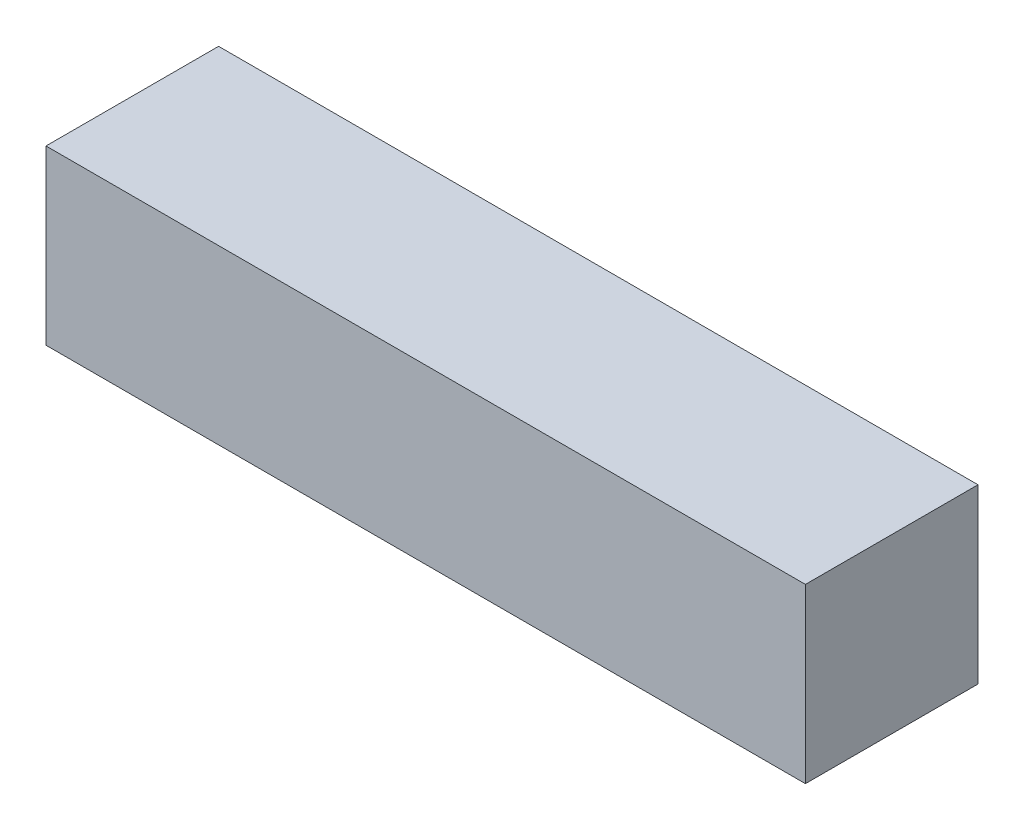
ISO-10303-21;
HEADER;
FILE_DESCRIPTION(('STEP AP214'),'2;1');
FILE_NAME('part.step','',(''),(''),'','','');
FILE_SCHEMA(('AUTOMOTIVE_DESIGN { 1 0 10303 214 1 1 1 1 }'));
ENDSEC;
DATA;
#1=APPLICATION_CONTEXT('core data for automotive mechanical design processes');
#2=APPLICATION_PROTOCOL_DEFINITION('international standard','automotive_design',2000,#1);
#3=PRODUCT_CONTEXT('',#1,'mechanical');
#4=PRODUCT('Part','Part','',(#3));
#5=PRODUCT_RELATED_PRODUCT_CATEGORY('part','',(#4));
#6=PRODUCT_DEFINITION_FORMATION('','',#4);
#7=PRODUCT_DEFINITION_CONTEXT('part definition',#1,'design');
#8=PRODUCT_DEFINITION('design','',#6,#7);
#9=PRODUCT_DEFINITION_SHAPE('','',#8);
#10=(LENGTH_UNIT() NAMED_UNIT(*) SI_UNIT(.MILLI.,.METRE.));
#11=(NAMED_UNIT(*) PLANE_ANGLE_UNIT() SI_UNIT($,.RADIAN.));
#12=(NAMED_UNIT(*) SI_UNIT($,.STERADIAN.) SOLID_ANGLE_UNIT());
#13=UNCERTAINTY_MEASURE_WITH_UNIT(LENGTH_MEASURE(1.E-05),#10,'distance_accuracy_value','');
#14=(GEOMETRIC_REPRESENTATION_CONTEXT(3) GLOBAL_UNCERTAINTY_ASSIGNED_CONTEXT((#13)) GLOBAL_UNIT_ASSIGNED_CONTEXT((#10,
#11,#12)) REPRESENTATION_CONTEXT('',''));
#15=CARTESIAN_POINT('',(0.,0.,0.));
#16=DIRECTION('',(0.,0.,1.));
#17=DIRECTION('',(1.,0.,0.));
#18=AXIS2_PLACEMENT_3D('',#15,#16,#17);
#19=CARTESIAN_POINT('',(-17.6236831500777,12.9181034482759,5.));
#20=DIRECTION('',(1.,0.,0.));
#21=DIRECTION('',(0.,1.,0.));
#22=AXIS2_PLACEMENT_3D('',#19,#20,#21);
#23=PLANE('',#22);
#24=DIRECTION('',(0.,-1.,0.));
#25=VECTOR('',#24,1.);
#26=CARTESIAN_POINT('',(-17.6236831500777,12.9181034482759,0.));
#27=LINE('',#26,#25);
#28=CARTESIAN_POINT('',(-17.6236831500777,12.9181034482759,0.));
#29=VERTEX_POINT('',#28);
#30=CARTESIAN_POINT('',(-17.6236831500777,7.91810344827586,0.));
#31=VERTEX_POINT('',#30);
#32=EDGE_CURVE('E96',#29,#31,#27,.T.);
#33=ORIENTED_EDGE('',*,*,#32,.T.);
#34=DIRECTION('',(0.,0.,-1.));
#35=VECTOR('',#34,1.);
#36=CARTESIAN_POINT('',(-17.6236831500777,7.91810344827586,5.));
#37=LINE('',#36,#35);
#38=CARTESIAN_POINT('',(-17.6236831500777,7.91810344827586,5.));
#39=VERTEX_POINT('',#38);
#40=EDGE_CURVE('E11',#39,#31,#37,.T.);
#41=ORIENTED_EDGE('',*,*,#40,.F.);
#42=DIRECTION('',(0.,-1.,0.));
#43=VECTOR('',#42,1.);
#44=CARTESIAN_POINT('',(-17.6236831500777,12.9181034482759,5.));
#45=LINE('',#44,#43);
#46=CARTESIAN_POINT('',(-17.6236831500777,12.9181034482759,5.));
#47=VERTEX_POINT('',#46);
#48=EDGE_CURVE('E84',#47,#39,#45,.T.);
#49=ORIENTED_EDGE('',*,*,#48,.F.);
#50=DIRECTION('',(0.,0.,-1.));
#51=VECTOR('',#50,1.);
#52=CARTESIAN_POINT('',(-17.6236831500777,12.9181034482759,5.));
#53=LINE('',#52,#51);
#54=EDGE_CURVE('E92',#47,#29,#53,.T.);
#55=ORIENTED_EDGE('',*,*,#54,.T.);
#56=EDGE_LOOP('',(#33,#41,#49,#55));
#57=FACE_BOUND('',#56,.T.);
#58=ADVANCED_FACE('F33',(#57),#23,.F.);
#59=CARTESIAN_POINT('',(-17.6236831500777,7.91810344827586,5.));
#60=DIRECTION('',(0.,1.,0.));
#61=DIRECTION('',(0.,0.,1.));
#62=AXIS2_PLACEMENT_3D('',#59,#60,#61);
#63=PLANE('',#62);
#64=DIRECTION('',(1.,0.,0.));
#65=VECTOR('',#64,1.);
#66=CARTESIAN_POINT('',(-17.6236831500777,7.91810344827586,0.));
#67=LINE('',#66,#65);
#68=CARTESIAN_POINT('',(4.37631684992228,7.91810344827586,0.));
#69=VERTEX_POINT('',#68);
#70=EDGE_CURVE('E88',#31,#69,#67,.T.);
#71=ORIENTED_EDGE('',*,*,#70,.T.);
#72=DIRECTION('',(0.,0.,-1.));
#73=VECTOR('',#72,1.);
#74=CARTESIAN_POINT('',(4.37631684992228,7.91810344827586,5.));
#75=LINE('',#74,#73);
#76=CARTESIAN_POINT('',(4.37631684992228,7.91810344827586,5.));
#77=VERTEX_POINT('',#76);
#78=EDGE_CURVE('E41',#77,#69,#75,.T.);
#79=ORIENTED_EDGE('',*,*,#78,.F.);
#80=DIRECTION('',(1.,0.,0.));
#81=VECTOR('',#80,1.);
#82=CARTESIAN_POINT('',(-17.6236831500777,7.91810344827586,5.));
#83=LINE('',#82,#81);
#84=EDGE_CURVE('E79',#39,#77,#83,.T.);
#85=ORIENTED_EDGE('',*,*,#84,.F.);
#86=ORIENTED_EDGE('',*,*,#40,.T.);
#87=EDGE_LOOP('',(#71,#79,#85,#86));
#88=FACE_BOUND('',#87,.T.);
#89=ADVANCED_FACE('F87',(#88),#63,.F.);
#90=CARTESIAN_POINT('',(4.37631684992228,12.9181034482759,5.));
#91=DIRECTION('',(-1.,0.,0.));
#92=DIRECTION('',(0.,0.,1.));
#93=AXIS2_PLACEMENT_3D('',#90,#91,#92);
#94=PLANE('',#93);
#95=DIRECTION('',(0.,1.,0.));
#96=VECTOR('',#95,1.);
#97=CARTESIAN_POINT('',(4.37631684992228,12.9181034482759,0.));
#98=LINE('',#97,#96);
#99=CARTESIAN_POINT('',(4.37631684992228,12.9181034482759,0.));
#100=VERTEX_POINT('',#99);
#101=EDGE_CURVE('E66',#69,#100,#98,.T.);
#102=ORIENTED_EDGE('',*,*,#101,.T.);
#103=DIRECTION('',(0.,0.,-1.));
#104=VECTOR('',#103,1.);
#105=CARTESIAN_POINT('',(4.37631684992228,12.9181034482759,5.));
#106=LINE('',#105,#104);
#107=CARTESIAN_POINT('',(4.37631684992228,12.9181034482759,5.));
#108=VERTEX_POINT('',#107);
#109=EDGE_CURVE('E89',#108,#100,#106,.T.);
#110=ORIENTED_EDGE('',*,*,#109,.F.);
#111=DIRECTION('',(0.,1.,0.));
#112=VECTOR('',#111,1.);
#113=CARTESIAN_POINT('',(4.37631684992228,12.9181034482759,5.));
#114=LINE('',#113,#112);
#115=EDGE_CURVE('E82',#77,#108,#114,.T.);
#116=ORIENTED_EDGE('',*,*,#115,.F.);
#117=ORIENTED_EDGE('',*,*,#78,.T.);
#118=EDGE_LOOP('',(#102,#110,#116,#117));
#119=FACE_BOUND('',#118,.T.);
#120=ADVANCED_FACE('F90',(#119),#94,.F.);
#121=CARTESIAN_POINT('',(-17.6236831500777,12.9181034482759,5.));
#122=DIRECTION('',(0.,-1.,0.));
#123=DIRECTION('',(0.,0.,-1.));
#124=AXIS2_PLACEMENT_3D('',#121,#122,#123);
#125=PLANE('',#124);
#126=DIRECTION('',(-1.,0.,0.));
#127=VECTOR('',#126,1.);
#128=CARTESIAN_POINT('',(-17.6236831500777,12.9181034482759,0.));
#129=LINE('',#128,#127);
#130=EDGE_CURVE('E72',#100,#29,#129,.T.);
#131=ORIENTED_EDGE('',*,*,#130,.T.);
#132=ORIENTED_EDGE('',*,*,#54,.F.);
#133=DIRECTION('',(-1.,0.,0.));
#134=VECTOR('',#133,1.);
#135=CARTESIAN_POINT('',(-17.6236831500777,12.9181034482759,5.));
#136=LINE('',#135,#134);
#137=EDGE_CURVE('E49',#108,#47,#136,.T.);
#138=ORIENTED_EDGE('',*,*,#137,.F.);
#139=ORIENTED_EDGE('',*,*,#109,.T.);
#140=EDGE_LOOP('',(#131,#132,#138,#139));
#141=FACE_BOUND('',#140,.T.);
#142=ADVANCED_FACE('F103',(#141),#125,.F.);
#143=CARTESIAN_POINT('',(0.,0.,5.));
#144=DIRECTION('',(0.,0.,1.));
#145=DIRECTION('',(1.,0.,0.));
#146=AXIS2_PLACEMENT_3D('',#143,#144,#145);
#147=PLANE('',#146);
#148=ORIENTED_EDGE('',*,*,#48,.T.);
#149=ORIENTED_EDGE('',*,*,#84,.T.);
#150=ORIENTED_EDGE('',*,*,#115,.T.);
#151=ORIENTED_EDGE('',*,*,#137,.T.);
#152=EDGE_LOOP('',(#148,#149,#150,#151));
#153=FACE_BOUND('',#152,.T.);
#154=ADVANCED_FACE('F80',(#153),#147,.T.);
#155=CARTESIAN_POINT('',(0.,0.,0.));
#156=DIRECTION('',(0.,0.,1.));
#157=DIRECTION('',(1.,0.,0.));
#158=AXIS2_PLACEMENT_3D('',#155,#156,#157);
#159=PLANE('',#158);
#160=ORIENTED_EDGE('',*,*,#32,.F.);
#161=ORIENTED_EDGE('',*,*,#130,.F.);
#162=ORIENTED_EDGE('',*,*,#101,.F.);
#163=ORIENTED_EDGE('',*,*,#70,.F.);
#164=EDGE_LOOP('',(#160,#161,#162,#163));
#165=FACE_BOUND('',#164,.T.);
#166=ADVANCED_FACE('F106',(#165),#159,.F.);
#167=CLOSED_SHELL('',(#58,#89,#120,#142,#154,#166));
#168=MANIFOLD_SOLID_BREP('B2',#167);
#169=ADVANCED_BREP_SHAPE_REPRESENTATION('',(#18,#168),#14);
#170=SHAPE_DEFINITION_REPRESENTATION(#9,#169);
ENDSEC;
END-ISO-10303-21;
